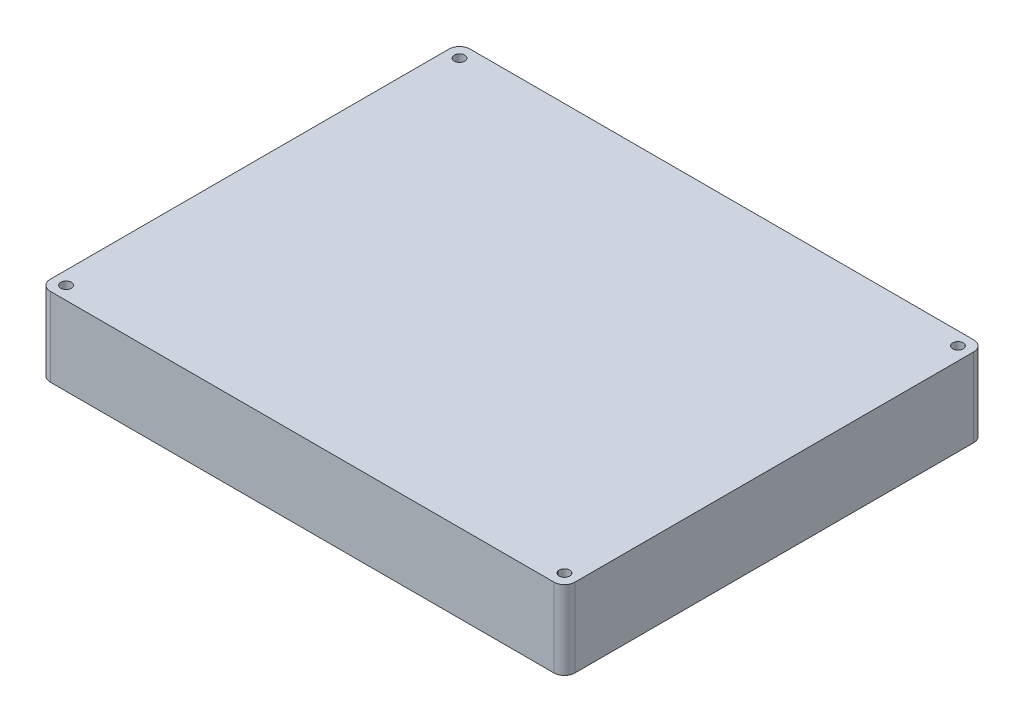
ISO-10303-21;
HEADER;
FILE_DESCRIPTION(('STEP AP214'),'2;1');
FILE_NAME('part.step','',(''),(''),'','','');
FILE_SCHEMA(('AUTOMOTIVE_DESIGN { 1 0 10303 214 1 1 1 1 }'));
ENDSEC;
DATA;
#1=APPLICATION_CONTEXT('core data for automotive mechanical design processes');
#2=APPLICATION_PROTOCOL_DEFINITION('international standard','automotive_design',2000,#1);
#3=PRODUCT_CONTEXT('',#1,'mechanical');
#4=PRODUCT('Part','Part','',(#3));
#5=PRODUCT_RELATED_PRODUCT_CATEGORY('part','',(#4));
#6=PRODUCT_DEFINITION_FORMATION('','',#4);
#7=PRODUCT_DEFINITION_CONTEXT('part definition',#1,'design');
#8=PRODUCT_DEFINITION('design','',#6,#7);
#9=PRODUCT_DEFINITION_SHAPE('','',#8);
#10=(LENGTH_UNIT() NAMED_UNIT(*) SI_UNIT(.MILLI.,.METRE.));
#11=(NAMED_UNIT(*) PLANE_ANGLE_UNIT() SI_UNIT($,.RADIAN.));
#12=(NAMED_UNIT(*) SI_UNIT($,.STERADIAN.) SOLID_ANGLE_UNIT());
#13=UNCERTAINTY_MEASURE_WITH_UNIT(LENGTH_MEASURE(1.E-05),#10,'distance_accuracy_value','');
#14=(GEOMETRIC_REPRESENTATION_CONTEXT(3) GLOBAL_UNCERTAINTY_ASSIGNED_CONTEXT((#13)) GLOBAL_UNIT_ASSIGNED_CONTEXT((#10,
#11,#12)) REPRESENTATION_CONTEXT('',''));
#15=CARTESIAN_POINT('',(0.,0.,0.));
#16=DIRECTION('',(0.,0.,1.));
#17=DIRECTION('',(1.,0.,0.));
#18=AXIS2_PLACEMENT_3D('',#15,#16,#17);
#19=CARTESIAN_POINT('',(-48.,15.,38.));
#20=DIRECTION('',(0.,-1.,0.));
#21=DIRECTION('',(0.,0.,-1.));
#22=AXIS2_PLACEMENT_3D('',#19,#20,#21);
#23=CYLINDRICAL_SURFACE('',#22,2.);
#24=CARTESIAN_POINT('',(-48.,0.,38.));
#25=DIRECTION('',(0.,1.,0.));
#26=DIRECTION('',(0.,0.,-1.));
#27=AXIS2_PLACEMENT_3D('',#24,#25,#26);
#28=CIRCLE('',#27,2.);
#29=CARTESIAN_POINT('',(-50.,0.,38.));
#30=VERTEX_POINT('',#29);
#31=CARTESIAN_POINT('',(-48.,0.,40.));
#32=VERTEX_POINT('',#31);
#33=EDGE_CURVE('E140',#30,#32,#28,.T.);
#34=ORIENTED_EDGE('',*,*,#33,.T.);
#35=DIRECTION('',(0.,-1.,0.));
#36=VECTOR('',#35,1.);
#37=CARTESIAN_POINT('',(-48.,15.,40.));
#38=LINE('',#37,#36);
#39=CARTESIAN_POINT('',(-48.,15.,40.));
#40=VERTEX_POINT('',#39);
#41=EDGE_CURVE('E11',#40,#32,#38,.T.);
#42=ORIENTED_EDGE('',*,*,#41,.F.);
#43=CARTESIAN_POINT('',(-48.,15.,38.));
#44=DIRECTION('',(0.,1.,0.));
#45=DIRECTION('',(0.,0.,-1.));
#46=AXIS2_PLACEMENT_3D('',#43,#44,#45);
#47=CIRCLE('',#46,2.);
#48=CARTESIAN_POINT('',(-50.,15.,38.));
#49=VERTEX_POINT('',#48);
#50=EDGE_CURVE('E163',#49,#40,#47,.T.);
#51=ORIENTED_EDGE('',*,*,#50,.F.);
#52=DIRECTION('',(0.,-1.,0.));
#53=VECTOR('',#52,1.);
#54=CARTESIAN_POINT('',(-50.,15.,38.));
#55=LINE('',#54,#53);
#56=EDGE_CURVE('E136',#49,#30,#55,.T.);
#57=ORIENTED_EDGE('',*,*,#56,.T.);
#58=EDGE_LOOP('',(#34,#42,#51,#57));
#59=FACE_BOUND('',#58,.T.);
#60=ADVANCED_FACE('F39',(#59),#23,.T.);
#61=CARTESIAN_POINT('',(48.,15.,40.));
#62=DIRECTION('',(0.,0.,-1.));
#63=DIRECTION('',(-1.,0.,0.));
#64=AXIS2_PLACEMENT_3D('',#61,#62,#63);
#65=PLANE('',#64);
#66=DIRECTION('',(1.,0.,0.));
#67=VECTOR('',#66,1.);
#68=CARTESIAN_POINT('',(48.,0.,40.));
#69=LINE('',#68,#67);
#70=CARTESIAN_POINT('',(48.,0.,40.));
#71=VERTEX_POINT('',#70);
#72=EDGE_CURVE('E144',#32,#71,#69,.T.);
#73=ORIENTED_EDGE('',*,*,#72,.T.);
#74=DIRECTION('',(0.,-1.,0.));
#75=VECTOR('',#74,1.);
#76=CARTESIAN_POINT('',(48.,15.,40.));
#77=LINE('',#76,#75);
#78=CARTESIAN_POINT('',(48.,15.,40.));
#79=VERTEX_POINT('',#78);
#80=EDGE_CURVE('E48',#79,#71,#77,.T.);
#81=ORIENTED_EDGE('',*,*,#80,.F.);
#82=DIRECTION('',(1.,0.,0.));
#83=VECTOR('',#82,1.);
#84=CARTESIAN_POINT('',(48.,15.,40.));
#85=LINE('',#84,#83);
#86=EDGE_CURVE('E99',#40,#79,#85,.T.);
#87=ORIENTED_EDGE('',*,*,#86,.F.);
#88=ORIENTED_EDGE('',*,*,#41,.T.);
#89=EDGE_LOOP('',(#73,#81,#87,#88));
#90=FACE_BOUND('',#89,.T.);
#91=ADVANCED_FACE('F267',(#90),#65,.F.);
#92=CARTESIAN_POINT('',(48.,15.,38.));
#93=DIRECTION('',(0.,-1.,0.));
#94=DIRECTION('',(0.,0.,-1.));
#95=AXIS2_PLACEMENT_3D('',#92,#93,#94);
#96=CYLINDRICAL_SURFACE('',#95,2.);
#97=CARTESIAN_POINT('',(48.,0.,38.));
#98=DIRECTION('',(0.,1.,0.));
#99=DIRECTION('',(0.,0.,1.));
#100=AXIS2_PLACEMENT_3D('',#97,#98,#99);
#101=CIRCLE('',#100,2.);
#102=CARTESIAN_POINT('',(50.,0.,38.));
#103=VERTEX_POINT('',#102);
#104=EDGE_CURVE('E148',#71,#103,#101,.T.);
#105=ORIENTED_EDGE('',*,*,#104,.T.);
#106=DIRECTION('',(0.,-1.,0.));
#107=VECTOR('',#106,1.);
#108=CARTESIAN_POINT('',(50.,15.,38.));
#109=LINE('',#108,#107);
#110=CARTESIAN_POINT('',(50.,15.,38.));
#111=VERTEX_POINT('',#110);
#112=EDGE_CURVE('E174',#111,#103,#109,.T.);
#113=ORIENTED_EDGE('',*,*,#112,.F.);
#114=CARTESIAN_POINT('',(48.,15.,38.));
#115=DIRECTION('',(0.,1.,0.));
#116=DIRECTION('',(0.,0.,1.));
#117=AXIS2_PLACEMENT_3D('',#114,#115,#116);
#118=CIRCLE('',#117,2.);
#119=EDGE_CURVE('E184',#79,#111,#118,.T.);
#120=ORIENTED_EDGE('',*,*,#119,.F.);
#121=ORIENTED_EDGE('',*,*,#80,.T.);
#122=EDGE_LOOP('',(#105,#113,#120,#121));
#123=FACE_BOUND('',#122,.T.);
#124=ADVANCED_FACE('F182',(#123),#96,.T.);
#125=CARTESIAN_POINT('',(50.,15.,38.));
#126=DIRECTION('',(-1.,0.,0.));
#127=DIRECTION('',(0.,0.,1.));
#128=AXIS2_PLACEMENT_3D('',#125,#126,#127);
#129=PLANE('',#128);
#130=DIRECTION('',(0.,0.,-1.));
#131=VECTOR('',#130,1.);
#132=CARTESIAN_POINT('',(50.,0.,38.));
#133=LINE('',#132,#131);
#134=CARTESIAN_POINT('',(50.,0.,-38.));
#135=VERTEX_POINT('',#134);
#136=EDGE_CURVE('E151',#103,#135,#133,.T.);
#137=ORIENTED_EDGE('',*,*,#136,.T.);
#138=DIRECTION('',(0.,-1.,0.));
#139=VECTOR('',#138,1.);
#140=CARTESIAN_POINT('',(50.,15.,-38.));
#141=LINE('',#140,#139);
#142=CARTESIAN_POINT('',(50.,15.,-38.));
#143=VERTEX_POINT('',#142);
#144=EDGE_CURVE('E170',#143,#135,#141,.T.);
#145=ORIENTED_EDGE('',*,*,#144,.F.);
#146=DIRECTION('',(0.,0.,-1.));
#147=VECTOR('',#146,1.);
#148=CARTESIAN_POINT('',(50.,15.,38.));
#149=LINE('',#148,#147);
#150=EDGE_CURVE('E197',#111,#143,#149,.T.);
#151=ORIENTED_EDGE('',*,*,#150,.F.);
#152=ORIENTED_EDGE('',*,*,#112,.T.);
#153=EDGE_LOOP('',(#137,#145,#151,#152));
#154=FACE_BOUND('',#153,.T.);
#155=ADVANCED_FACE('F192',(#154),#129,.F.);
#156=CARTESIAN_POINT('',(48.,15.,-38.));
#157=DIRECTION('',(0.,-1.,0.));
#158=DIRECTION('',(0.,0.,-1.));
#159=AXIS2_PLACEMENT_3D('',#156,#157,#158);
#160=CYLINDRICAL_SURFACE('',#159,2.);
#161=CARTESIAN_POINT('',(48.,0.,-38.));
#162=DIRECTION('',(0.,1.,0.));
#163=DIRECTION('',(0.,0.,1.));
#164=AXIS2_PLACEMENT_3D('',#161,#162,#163);
#165=CIRCLE('',#164,2.);
#166=CARTESIAN_POINT('',(48.,0.,-40.));
#167=VERTEX_POINT('',#166);
#168=EDGE_CURVE('E154',#135,#167,#165,.T.);
#169=ORIENTED_EDGE('',*,*,#168,.T.);
#170=DIRECTION('',(0.,-1.,0.));
#171=VECTOR('',#170,1.);
#172=CARTESIAN_POINT('',(48.,15.,-40.));
#173=LINE('',#172,#171);
#174=CARTESIAN_POINT('',(48.,15.,-40.));
#175=VERTEX_POINT('',#174);
#176=EDGE_CURVE('E129',#175,#167,#173,.T.);
#177=ORIENTED_EDGE('',*,*,#176,.F.);
#178=CARTESIAN_POINT('',(48.,15.,-38.));
#179=DIRECTION('',(0.,1.,0.));
#180=DIRECTION('',(0.,0.,1.));
#181=AXIS2_PLACEMENT_3D('',#178,#179,#180);
#182=CIRCLE('',#181,2.);
#183=EDGE_CURVE('E118',#143,#175,#182,.T.);
#184=ORIENTED_EDGE('',*,*,#183,.F.);
#185=ORIENTED_EDGE('',*,*,#144,.T.);
#186=EDGE_LOOP('',(#169,#177,#184,#185));
#187=FACE_BOUND('',#186,.T.);
#188=ADVANCED_FACE('F195',(#187),#160,.T.);
#189=CARTESIAN_POINT('',(48.,15.,-40.));
#190=DIRECTION('',(0.,0.,1.));
#191=DIRECTION('',(1.,0.,0.));
#192=AXIS2_PLACEMENT_3D('',#189,#190,#191);
#193=PLANE('',#192);
#194=DIRECTION('',(-1.,0.,0.));
#195=VECTOR('',#194,1.);
#196=CARTESIAN_POINT('',(48.,0.,-40.));
#197=LINE('',#196,#195);
#198=CARTESIAN_POINT('',(-48.,0.,-40.));
#199=VERTEX_POINT('',#198);
#200=EDGE_CURVE('E127',#167,#199,#197,.T.);
#201=ORIENTED_EDGE('',*,*,#200,.T.);
#202=DIRECTION('',(0.,-1.,0.));
#203=VECTOR('',#202,1.);
#204=CARTESIAN_POINT('',(-48.,15.,-40.));
#205=LINE('',#204,#203);
#206=CARTESIAN_POINT('',(-48.,15.,-40.));
#207=VERTEX_POINT('',#206);
#208=EDGE_CURVE('E124',#207,#199,#205,.T.);
#209=ORIENTED_EDGE('',*,*,#208,.F.);
#210=DIRECTION('',(-1.,0.,0.));
#211=VECTOR('',#210,1.);
#212=CARTESIAN_POINT('',(48.,15.,-40.));
#213=LINE('',#212,#211);
#214=EDGE_CURVE('E112',#175,#207,#213,.T.);
#215=ORIENTED_EDGE('',*,*,#214,.F.);
#216=ORIENTED_EDGE('',*,*,#176,.T.);
#217=EDGE_LOOP('',(#201,#209,#215,#216));
#218=FACE_BOUND('',#217,.T.);
#219=ADVANCED_FACE('F125',(#218),#193,.F.);
#220=CARTESIAN_POINT('',(-48.,15.,-38.));
#221=DIRECTION('',(0.,-1.,0.));
#222=DIRECTION('',(0.,0.,-1.));
#223=AXIS2_PLACEMENT_3D('',#220,#221,#222);
#224=CYLINDRICAL_SURFACE('',#223,2.);
#225=CARTESIAN_POINT('',(-48.,0.,-38.));
#226=DIRECTION('',(0.,1.,0.));
#227=DIRECTION('',(0.,0.,1.));
#228=AXIS2_PLACEMENT_3D('',#225,#226,#227);
#229=CIRCLE('',#228,2.);
#230=CARTESIAN_POINT('',(-50.,0.,-38.));
#231=VERTEX_POINT('',#230);
#232=EDGE_CURVE('E85',#199,#231,#229,.T.);
#233=ORIENTED_EDGE('',*,*,#232,.T.);
#234=DIRECTION('',(0.,-1.,0.));
#235=VECTOR('',#234,1.);
#236=CARTESIAN_POINT('',(-50.,15.,-38.));
#237=LINE('',#236,#235);
#238=CARTESIAN_POINT('',(-50.,15.,-38.));
#239=VERTEX_POINT('',#238);
#240=EDGE_CURVE('E130',#239,#231,#237,.T.);
#241=ORIENTED_EDGE('',*,*,#240,.F.);
#242=CARTESIAN_POINT('',(-48.,15.,-38.));
#243=DIRECTION('',(0.,1.,0.));
#244=DIRECTION('',(0.,0.,1.));
#245=AXIS2_PLACEMENT_3D('',#242,#243,#244);
#246=CIRCLE('',#245,2.);
#247=EDGE_CURVE('E116',#207,#239,#246,.T.);
#248=ORIENTED_EDGE('',*,*,#247,.F.);
#249=ORIENTED_EDGE('',*,*,#208,.T.);
#250=EDGE_LOOP('',(#233,#241,#248,#249));
#251=FACE_BOUND('',#250,.T.);
#252=ADVANCED_FACE('F132',(#251),#224,.T.);
#253=CARTESIAN_POINT('',(-50.,15.,38.));
#254=DIRECTION('',(1.,0.,0.));
#255=DIRECTION('',(0.,0.,-1.));
#256=AXIS2_PLACEMENT_3D('',#253,#254,#255);
#257=PLANE('',#256);
#258=DIRECTION('',(0.,0.,1.));
#259=VECTOR('',#258,1.);
#260=CARTESIAN_POINT('',(-50.,0.,38.));
#261=LINE('',#260,#259);
#262=EDGE_CURVE('E91',#231,#30,#261,.T.);
#263=ORIENTED_EDGE('',*,*,#262,.T.);
#264=ORIENTED_EDGE('',*,*,#56,.F.);
#265=DIRECTION('',(0.,0.,1.));
#266=VECTOR('',#265,1.);
#267=CARTESIAN_POINT('',(-50.,15.,38.));
#268=LINE('',#267,#266);
#269=EDGE_CURVE('E56',#239,#49,#268,.T.);
#270=ORIENTED_EDGE('',*,*,#269,.F.);
#271=ORIENTED_EDGE('',*,*,#240,.T.);
#272=EDGE_LOOP('',(#263,#264,#270,#271));
#273=FACE_BOUND('',#272,.T.);
#274=ADVANCED_FACE('F251',(#273),#257,.F.);
#275=CARTESIAN_POINT('',(-48.,15.,38.));
#276=DIRECTION('',(0.,-1.,0.));
#277=DIRECTION('',(0.,0.,-1.));
#278=AXIS2_PLACEMENT_3D('',#275,#276,#277);
#279=PLANE('',#278);
#280=CARTESIAN_POINT('',(-47.5,15.,37.5));
#281=DIRECTION('',(0.,1.,0.));
#282=DIRECTION('',(0.,0.,1.));
#283=AXIS2_PLACEMENT_3D('',#280,#281,#282);
#284=CIRCLE('',#283,0.999999999999998);
#285=CARTESIAN_POINT('',(-47.5,15.,38.5));
#286=VERTEX_POINT('',#285);
#287=EDGE_CURVE('E215',#286,#286,#284,.T.);
#288=ORIENTED_EDGE('',*,*,#287,.F.);
#289=EDGE_LOOP('',(#288));
#290=FACE_BOUND('',#289,.T.);
#291=CARTESIAN_POINT('',(47.5,15.,37.5));
#292=DIRECTION('',(0.,1.,0.));
#293=DIRECTION('',(0.,0.,1.));
#294=AXIS2_PLACEMENT_3D('',#291,#292,#293);
#295=CIRCLE('',#294,0.999999999999998);
#296=CARTESIAN_POINT('',(47.5,15.,38.5));
#297=VERTEX_POINT('',#296);
#298=EDGE_CURVE('E223',#297,#297,#295,.T.);
#299=ORIENTED_EDGE('',*,*,#298,.F.);
#300=EDGE_LOOP('',(#299));
#301=FACE_BOUND('',#300,.T.);
#302=CARTESIAN_POINT('',(47.5,15.,-37.5));
#303=DIRECTION('',(0.,1.,0.));
#304=DIRECTION('',(0.,0.,1.));
#305=AXIS2_PLACEMENT_3D('',#302,#303,#304);
#306=CIRCLE('',#305,0.999999999999998);
#307=CARTESIAN_POINT('',(47.5,15.,-36.5));
#308=VERTEX_POINT('',#307);
#309=EDGE_CURVE('E231',#308,#308,#306,.T.);
#310=ORIENTED_EDGE('',*,*,#309,.F.);
#311=EDGE_LOOP('',(#310));
#312=FACE_BOUND('',#311,.T.);
#313=CARTESIAN_POINT('',(-47.5,15.,-37.5));
#314=DIRECTION('',(0.,1.,0.));
#315=DIRECTION('',(0.,0.,1.));
#316=AXIS2_PLACEMENT_3D('',#313,#314,#315);
#317=CIRCLE('',#316,0.999999999999998);
#318=CARTESIAN_POINT('',(-47.5,15.,-36.5));
#319=VERTEX_POINT('',#318);
#320=EDGE_CURVE('E207',#319,#319,#317,.T.);
#321=ORIENTED_EDGE('',*,*,#320,.F.);
#322=EDGE_LOOP('',(#321));
#323=FACE_BOUND('',#322,.T.);
#324=ORIENTED_EDGE('',*,*,#50,.T.);
#325=ORIENTED_EDGE('',*,*,#86,.T.);
#326=ORIENTED_EDGE('',*,*,#119,.T.);
#327=ORIENTED_EDGE('',*,*,#150,.T.);
#328=ORIENTED_EDGE('',*,*,#183,.T.);
#329=ORIENTED_EDGE('',*,*,#214,.T.);
#330=ORIENTED_EDGE('',*,*,#247,.T.);
#331=ORIENTED_EDGE('',*,*,#269,.T.);
#332=EDGE_LOOP('',(#324,#325,#326,#327,#328,#329,#330,#331));
#333=FACE_BOUND('',#332,.T.);
#334=ADVANCED_FACE('F114',(#290,#301,#312,#323,#333),#279,.F.);
#335=CARTESIAN_POINT('',(-48.,0.,38.));
#336=DIRECTION('',(0.,-1.,0.));
#337=DIRECTION('',(0.,0.,-1.));
#338=AXIS2_PLACEMENT_3D('',#335,#336,#337);
#339=PLANE('',#338);
#340=CARTESIAN_POINT('',(-47.5,0.,37.5));
#341=DIRECTION('',(0.,1.,0.));
#342=DIRECTION('',(0.,0.,1.));
#343=AXIS2_PLACEMENT_3D('',#340,#341,#342);
#344=CIRCLE('',#343,0.999999999999998);
#345=CARTESIAN_POINT('',(-47.5,0.,38.5));
#346=VERTEX_POINT('',#345);
#347=EDGE_CURVE('E219',#346,#346,#344,.T.);
#348=ORIENTED_EDGE('',*,*,#347,.T.);
#349=EDGE_LOOP('',(#348));
#350=FACE_BOUND('',#349,.T.);
#351=CARTESIAN_POINT('',(47.5,0.,37.5));
#352=DIRECTION('',(0.,1.,0.));
#353=DIRECTION('',(0.,0.,1.));
#354=AXIS2_PLACEMENT_3D('',#351,#352,#353);
#355=CIRCLE('',#354,0.999999999999998);
#356=CARTESIAN_POINT('',(47.5,0.,38.5));
#357=VERTEX_POINT('',#356);
#358=EDGE_CURVE('E227',#357,#357,#355,.T.);
#359=ORIENTED_EDGE('',*,*,#358,.T.);
#360=EDGE_LOOP('',(#359));
#361=FACE_BOUND('',#360,.T.);
#362=CARTESIAN_POINT('',(47.5,0.,-37.5));
#363=DIRECTION('',(0.,1.,0.));
#364=DIRECTION('',(0.,0.,1.));
#365=AXIS2_PLACEMENT_3D('',#362,#363,#364);
#366=CIRCLE('',#365,0.999999999999998);
#367=CARTESIAN_POINT('',(47.5,0.,-36.5));
#368=VERTEX_POINT('',#367);
#369=EDGE_CURVE('E211',#368,#368,#366,.T.);
#370=ORIENTED_EDGE('',*,*,#369,.T.);
#371=EDGE_LOOP('',(#370));
#372=FACE_BOUND('',#371,.T.);
#373=CARTESIAN_POINT('',(-47.5,0.,-37.5));
#374=DIRECTION('',(0.,1.,0.));
#375=DIRECTION('',(0.,0.,1.));
#376=AXIS2_PLACEMENT_3D('',#373,#374,#375);
#377=CIRCLE('',#376,0.999999999999998);
#378=CARTESIAN_POINT('',(-47.5,0.,-36.5));
#379=VERTEX_POINT('',#378);
#380=EDGE_CURVE('E145',#379,#379,#377,.T.);
#381=ORIENTED_EDGE('',*,*,#380,.T.);
#382=EDGE_LOOP('',(#381));
#383=FACE_BOUND('',#382,.T.);
#384=ORIENTED_EDGE('',*,*,#33,.F.);
#385=ORIENTED_EDGE('',*,*,#262,.F.);
#386=ORIENTED_EDGE('',*,*,#232,.F.);
#387=ORIENTED_EDGE('',*,*,#200,.F.);
#388=ORIENTED_EDGE('',*,*,#168,.F.);
#389=ORIENTED_EDGE('',*,*,#136,.F.);
#390=ORIENTED_EDGE('',*,*,#104,.F.);
#391=ORIENTED_EDGE('',*,*,#72,.F.);
#392=EDGE_LOOP('',(#384,#385,#386,#387,#388,#389,#390,#391));
#393=FACE_BOUND('',#392,.T.);
#394=ADVANCED_FACE('F188',(#350,#361,#372,#383,#393),#339,.T.);
#395=CARTESIAN_POINT('',(-47.5,0.,-37.5));
#396=DIRECTION('',(0.,1.,0.));
#397=DIRECTION('',(0.,0.,1.));
#398=AXIS2_PLACEMENT_3D('',#395,#396,#397);
#399=CYLINDRICAL_SURFACE('',#398,0.999999999999998);
#400=ORIENTED_EDGE('',*,*,#380,.F.);
#401=EDGE_LOOP('',(#400));
#402=FACE_BOUND('',#401,.T.);
#403=ORIENTED_EDGE('',*,*,#320,.T.);
#404=EDGE_LOOP('',(#403));
#405=FACE_BOUND('',#404,.T.);
#406=ADVANCED_FACE('F245',(#402,#405),#399,.F.);
#407=CARTESIAN_POINT('',(47.5,0.,-37.5));
#408=DIRECTION('',(0.,1.,0.));
#409=DIRECTION('',(0.,0.,1.));
#410=AXIS2_PLACEMENT_3D('',#407,#408,#409);
#411=CYLINDRICAL_SURFACE('',#410,0.999999999999998);
#412=ORIENTED_EDGE('',*,*,#369,.F.);
#413=EDGE_LOOP('',(#412));
#414=FACE_BOUND('',#413,.T.);
#415=ORIENTED_EDGE('',*,*,#309,.T.);
#416=EDGE_LOOP('',(#415));
#417=FACE_BOUND('',#416,.T.);
#418=ADVANCED_FACE('F241',(#414,#417),#411,.F.);
#419=CARTESIAN_POINT('',(47.5,0.,37.5));
#420=DIRECTION('',(0.,1.,0.));
#421=DIRECTION('',(0.,0.,1.));
#422=AXIS2_PLACEMENT_3D('',#419,#420,#421);
#423=CYLINDRICAL_SURFACE('',#422,0.999999999999998);
#424=ORIENTED_EDGE('',*,*,#358,.F.);
#425=EDGE_LOOP('',(#424));
#426=FACE_BOUND('',#425,.T.);
#427=ORIENTED_EDGE('',*,*,#298,.T.);
#428=EDGE_LOOP('',(#427));
#429=FACE_BOUND('',#428,.T.);
#430=ADVANCED_FACE('F244',(#426,#429),#423,.F.);
#431=CARTESIAN_POINT('',(-47.5,0.,37.5));
#432=DIRECTION('',(0.,1.,0.));
#433=DIRECTION('',(0.,0.,1.));
#434=AXIS2_PLACEMENT_3D('',#431,#432,#433);
#435=CYLINDRICAL_SURFACE('',#434,0.999999999999998);
#436=ORIENTED_EDGE('',*,*,#347,.F.);
#437=EDGE_LOOP('',(#436));
#438=FACE_BOUND('',#437,.T.);
#439=ORIENTED_EDGE('',*,*,#287,.T.);
#440=EDGE_LOOP('',(#439));
#441=FACE_BOUND('',#440,.T.);
#442=ADVANCED_FACE('F343',(#438,#441),#435,.F.);
#443=CLOSED_SHELL('',(#60,#91,#124,#155,#188,#219,#252,#274,#334,#394,#406,#418,#430,#442));
#444=MANIFOLD_SOLID_BREP('B2',#443);
#445=ADVANCED_BREP_SHAPE_REPRESENTATION('',(#18,#444),#14);
#446=SHAPE_DEFINITION_REPRESENTATION(#9,#445);
ENDSEC;
END-ISO-10303-21;
